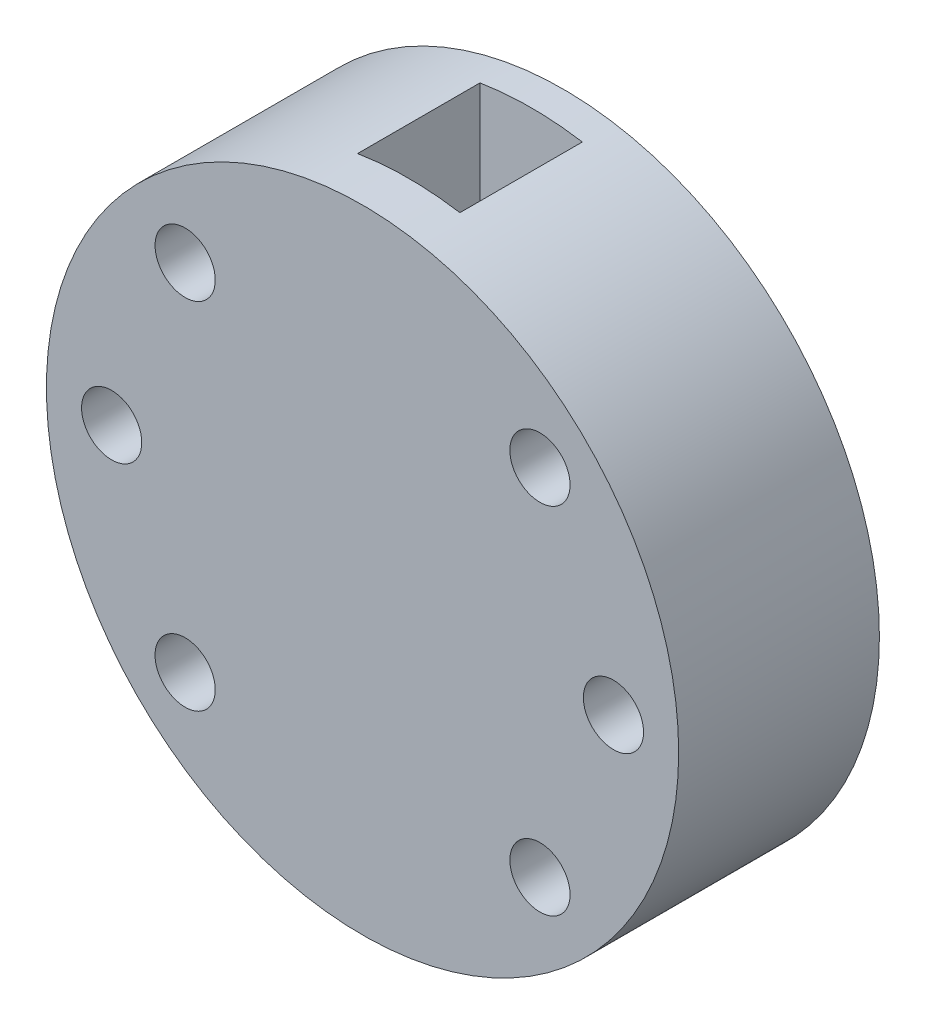
ISO-10303-21;
HEADER;
FILE_DESCRIPTION(('STEP AP214'),'2;1');
FILE_NAME('part.step','',(''),(''),'','','');
FILE_SCHEMA(('AUTOMOTIVE_DESIGN { 1 0 10303 214 1 1 1 1 }'));
ENDSEC;
DATA;
#1=APPLICATION_CONTEXT('core data for automotive mechanical design processes');
#2=APPLICATION_PROTOCOL_DEFINITION('international standard','automotive_design',2000,#1);
#3=PRODUCT_CONTEXT('',#1,'mechanical');
#4=PRODUCT('Part','Part','',(#3));
#5=PRODUCT_RELATED_PRODUCT_CATEGORY('part','',(#4));
#6=PRODUCT_DEFINITION_FORMATION('','',#4);
#7=PRODUCT_DEFINITION_CONTEXT('part definition',#1,'design');
#8=PRODUCT_DEFINITION('design','',#6,#7);
#9=PRODUCT_DEFINITION_SHAPE('','',#8);
#10=(LENGTH_UNIT() NAMED_UNIT(*) SI_UNIT(.MILLI.,.METRE.));
#11=(NAMED_UNIT(*) PLANE_ANGLE_UNIT() SI_UNIT($,.RADIAN.));
#12=(NAMED_UNIT(*) SI_UNIT($,.STERADIAN.) SOLID_ANGLE_UNIT());
#13=UNCERTAINTY_MEASURE_WITH_UNIT(LENGTH_MEASURE(1.E-05),#10,'distance_accuracy_value','');
#14=(GEOMETRIC_REPRESENTATION_CONTEXT(3) GLOBAL_UNCERTAINTY_ASSIGNED_CONTEXT((#13)) GLOBAL_UNIT_ASSIGNED_CONTEXT((#10,
#11,#12)) REPRESENTATION_CONTEXT('',''));
#15=CARTESIAN_POINT('',(0.,0.,0.));
#16=DIRECTION('',(0.,0.,1.));
#17=DIRECTION('',(1.,0.,0.));
#18=AXIS2_PLACEMENT_3D('',#15,#16,#17);
#19=CARTESIAN_POINT('',(0.,0.,20.));
#20=DIRECTION('',(0.,0.,-1.));
#21=DIRECTION('',(-1.,0.,0.));
#22=AXIS2_PLACEMENT_3D('',#19,#20,#21);
#23=CYLINDRICAL_SURFACE('',#22,31.5);
#24=DIRECTION('',(0.,0.,-1.));
#25=VECTOR('',#24,1.);
#26=CARTESIAN_POINT('',(5.1,-31.0844012327727,20.));
#27=LINE('',#26,#25);
#28=CARTESIAN_POINT('',(5.1,-31.0844012327727,3.2));
#29=VERTEX_POINT('',#28);
#30=CARTESIAN_POINT('',(5.1,-31.0844012327727,15.4));
#31=VERTEX_POINT('',#30);
#32=EDGE_CURVE('E108',#29,#31,#27,.F.);
#33=ORIENTED_EDGE('',*,*,#32,.F.);
#34=CARTESIAN_POINT('',(0.,0.,3.2));
#35=DIRECTION('',(0.,0.,1.));
#36=DIRECTION('',(1.,0.,0.));
#37=AXIS2_PLACEMENT_3D('',#34,#35,#36);
#38=CIRCLE('',#37,31.5);
#39=CARTESIAN_POINT('',(-5.1,-31.0844012327727,3.2));
#40=VERTEX_POINT('',#39);
#41=EDGE_CURVE('E104',#40,#29,#38,.T.);
#42=ORIENTED_EDGE('',*,*,#41,.F.);
#43=DIRECTION('',(0.,0.,-1.));
#44=VECTOR('',#43,1.);
#45=CARTESIAN_POINT('',(-5.1,-31.0844012327727,20.));
#46=LINE('',#45,#44);
#47=CARTESIAN_POINT('',(-5.1,-31.0844012327727,15.4));
#48=VERTEX_POINT('',#47);
#49=EDGE_CURVE('E88',#48,#40,#46,.T.);
#50=ORIENTED_EDGE('',*,*,#49,.F.);
#51=CARTESIAN_POINT('',(0.,0.,15.4));
#52=DIRECTION('',(0.,0.,-1.));
#53=DIRECTION('',(-1.,0.,0.));
#54=AXIS2_PLACEMENT_3D('',#51,#52,#53);
#55=CIRCLE('',#54,31.5);
#56=EDGE_CURVE('E82',#31,#48,#55,.T.);
#57=ORIENTED_EDGE('',*,*,#56,.F.);
#58=EDGE_LOOP('',(#33,#42,#50,#57));
#59=FACE_BOUND('',#58,.T.);
#60=CARTESIAN_POINT('',(0.,0.,20.));
#61=DIRECTION('',(0.,0.,1.));
#62=DIRECTION('',(1.,0.,0.));
#63=AXIS2_PLACEMENT_3D('',#60,#61,#62);
#64=CIRCLE('',#63,31.5);
#65=CARTESIAN_POINT('',(31.5,0.,20.));
#66=VERTEX_POINT('',#65);
#67=EDGE_CURVE('E89',#66,#66,#64,.T.);
#68=ORIENTED_EDGE('',*,*,#67,.F.);
#69=EDGE_LOOP('',(#68));
#70=FACE_BOUND('',#69,.T.);
#71=CARTESIAN_POINT('',(0.,0.,0.));
#72=DIRECTION('',(0.,0.,1.));
#73=DIRECTION('',(1.,0.,0.));
#74=AXIS2_PLACEMENT_3D('',#71,#72,#73);
#75=CIRCLE('',#74,31.5);
#76=CARTESIAN_POINT('',(31.5,0.,0.));
#77=VERTEX_POINT('',#76);
#78=EDGE_CURVE('E201',#77,#77,#75,.T.);
#79=ORIENTED_EDGE('',*,*,#78,.T.);
#80=EDGE_LOOP('',(#79));
#81=FACE_BOUND('',#80,.T.);
#82=DIRECTION('',(0.,0.,-1.));
#83=VECTOR('',#82,1.);
#84=CARTESIAN_POINT('',(5.1,31.0844012327727,20.));
#85=LINE('',#84,#83);
#86=CARTESIAN_POINT('',(5.1,31.0844012327727,15.4));
#87=VERTEX_POINT('',#86);
#88=CARTESIAN_POINT('',(5.1,31.0844012327727,3.2));
#89=VERTEX_POINT('',#88);
#90=EDGE_CURVE('E11',#87,#89,#85,.T.);
#91=ORIENTED_EDGE('',*,*,#90,.F.);
#92=CARTESIAN_POINT('',(-5.1,31.0844012327727,15.4));
#93=VERTEX_POINT('',#92);
#94=EDGE_CURVE('E91',#93,#87,#55,.T.);
#95=ORIENTED_EDGE('',*,*,#94,.F.);
#96=DIRECTION('',(0.,0.,-1.));
#97=VECTOR('',#96,1.);
#98=CARTESIAN_POINT('',(-5.1,31.0844012327727,20.));
#99=LINE('',#98,#97);
#100=CARTESIAN_POINT('',(-5.1,31.0844012327727,3.2));
#101=VERTEX_POINT('',#100);
#102=EDGE_CURVE('E97',#101,#93,#99,.F.);
#103=ORIENTED_EDGE('',*,*,#102,.F.);
#104=EDGE_CURVE('E52',#89,#101,#38,.T.);
#105=ORIENTED_EDGE('',*,*,#104,.F.);
#106=EDGE_LOOP('',(#91,#95,#103,#105));
#107=FACE_BOUND('',#106,.T.);
#108=ADVANCED_FACE('F43',(#59,#70,#81,#107),#23,.T.);
#109=CARTESIAN_POINT('',(0.,0.,20.));
#110=DIRECTION('',(0.,0.,1.));
#111=DIRECTION('',(1.,0.,0.));
#112=AXIS2_PLACEMENT_3D('',#109,#110,#111);
#113=PLANE('',#112);
#114=CARTESIAN_POINT('',(17.6776695296637,17.6776695296637,20.));
#115=DIRECTION('',(0.,0.,1.));
#116=DIRECTION('',(1.,0.,0.));
#117=AXIS2_PLACEMENT_3D('',#114,#115,#116);
#118=CIRCLE('',#117,3.);
#119=CARTESIAN_POINT('',(20.6776695296637,17.6776695296637,20.));
#120=VERTEX_POINT('',#119);
#121=EDGE_CURVE('E596',#120,#120,#118,.T.);
#122=ORIENTED_EDGE('',*,*,#121,.F.);
#123=EDGE_LOOP('',(#122));
#124=FACE_BOUND('',#123,.T.);
#125=CARTESIAN_POINT('',(25.,0.,20.));
#126=DIRECTION('',(0.,0.,1.));
#127=DIRECTION('',(1.,0.,0.));
#128=AXIS2_PLACEMENT_3D('',#125,#126,#127);
#129=CIRCLE('',#128,3.);
#130=CARTESIAN_POINT('',(28.,0.,20.));
#131=VERTEX_POINT('',#130);
#132=EDGE_CURVE('E592',#131,#131,#129,.T.);
#133=ORIENTED_EDGE('',*,*,#132,.F.);
#134=EDGE_LOOP('',(#133));
#135=FACE_BOUND('',#134,.T.);
#136=CARTESIAN_POINT('',(17.6776695296637,-17.6776695296637,20.));
#137=DIRECTION('',(0.,0.,1.));
#138=DIRECTION('',(1.,0.,0.));
#139=AXIS2_PLACEMENT_3D('',#136,#137,#138);
#140=CIRCLE('',#139,3.);
#141=CARTESIAN_POINT('',(20.6776695296637,-17.6776695296637,20.));
#142=VERTEX_POINT('',#141);
#143=EDGE_CURVE('E586',#142,#142,#140,.T.);
#144=ORIENTED_EDGE('',*,*,#143,.F.);
#145=EDGE_LOOP('',(#144));
#146=FACE_BOUND('',#145,.T.);
#147=CARTESIAN_POINT('',(-17.6776695296637,-17.6776695296637,20.));
#148=DIRECTION('',(0.,0.,1.));
#149=DIRECTION('',(1.,0.,0.));
#150=AXIS2_PLACEMENT_3D('',#147,#148,#149);
#151=CIRCLE('',#150,3.);
#152=CARTESIAN_POINT('',(-14.6776695296637,-17.6776695296637,20.));
#153=VERTEX_POINT('',#152);
#154=EDGE_CURVE('E580',#153,#153,#151,.T.);
#155=ORIENTED_EDGE('',*,*,#154,.F.);
#156=EDGE_LOOP('',(#155));
#157=FACE_BOUND('',#156,.T.);
#158=CARTESIAN_POINT('',(-25.,0.,20.));
#159=DIRECTION('',(0.,0.,1.));
#160=DIRECTION('',(1.,0.,0.));
#161=AXIS2_PLACEMENT_3D('',#158,#159,#160);
#162=CIRCLE('',#161,3.);
#163=CARTESIAN_POINT('',(-22.,0.,20.));
#164=VERTEX_POINT('',#163);
#165=EDGE_CURVE('E577',#164,#164,#162,.T.);
#166=ORIENTED_EDGE('',*,*,#165,.F.);
#167=EDGE_LOOP('',(#166));
#168=FACE_BOUND('',#167,.T.);
#169=CARTESIAN_POINT('',(-17.6776695296637,17.6776695296637,20.));
#170=DIRECTION('',(0.,0.,1.));
#171=DIRECTION('',(1.,0.,0.));
#172=AXIS2_PLACEMENT_3D('',#169,#170,#171);
#173=CIRCLE('',#172,3.);
#174=CARTESIAN_POINT('',(-14.6776695296637,17.6776695296637,20.));
#175=VERTEX_POINT('',#174);
#176=EDGE_CURVE('E121',#175,#175,#173,.T.);
#177=ORIENTED_EDGE('',*,*,#176,.F.);
#178=EDGE_LOOP('',(#177));
#179=FACE_BOUND('',#178,.T.);
#180=ORIENTED_EDGE('',*,*,#67,.T.);
#181=EDGE_LOOP('',(#180));
#182=FACE_BOUND('',#181,.T.);
#183=ADVANCED_FACE('F213',(#124,#135,#146,#157,#168,#179,#182),#113,.T.);
#184=CARTESIAN_POINT('',(0.,0.,0.));
#185=DIRECTION('',(0.,0.,1.));
#186=DIRECTION('',(1.,0.,0.));
#187=AXIS2_PLACEMENT_3D('',#184,#185,#186);
#188=PLANE('',#187);
#189=CARTESIAN_POINT('',(-17.6776695296637,-17.6776695296637,0.));
#190=DIRECTION('',(0.,0.,1.));
#191=DIRECTION('',(1.,0.,0.));
#192=AXIS2_PLACEMENT_3D('',#189,#190,#191);
#193=CIRCLE('',#192,4.5);
#194=CARTESIAN_POINT('',(-13.1776695296637,-17.6776695296637,0.));
#195=VERTEX_POINT('',#194);
#196=EDGE_CURVE('E154',#195,#195,#193,.T.);
#197=ORIENTED_EDGE('',*,*,#196,.T.);
#198=EDGE_LOOP('',(#197));
#199=FACE_BOUND('',#198,.T.);
#200=CARTESIAN_POINT('',(-17.6776695296637,17.6776695296637,0.));
#201=DIRECTION('',(0.,0.,1.));
#202=DIRECTION('',(1.,0.,0.));
#203=AXIS2_PLACEMENT_3D('',#200,#201,#202);
#204=CIRCLE('',#203,4.5);
#205=CARTESIAN_POINT('',(-13.1776695296637,17.6776695296637,0.));
#206=VERTEX_POINT('',#205);
#207=EDGE_CURVE('E163',#206,#206,#204,.T.);
#208=ORIENTED_EDGE('',*,*,#207,.T.);
#209=EDGE_LOOP('',(#208));
#210=FACE_BOUND('',#209,.T.);
#211=CARTESIAN_POINT('',(17.6776695296637,-17.6776695296637,0.));
#212=DIRECTION('',(0.,0.,1.));
#213=DIRECTION('',(1.,0.,0.));
#214=AXIS2_PLACEMENT_3D('',#211,#212,#213);
#215=CIRCLE('',#214,4.5);
#216=CARTESIAN_POINT('',(22.1776695296637,-17.6776695296637,0.));
#217=VERTEX_POINT('',#216);
#218=EDGE_CURVE('E171',#217,#217,#215,.T.);
#219=ORIENTED_EDGE('',*,*,#218,.T.);
#220=EDGE_LOOP('',(#219));
#221=FACE_BOUND('',#220,.T.);
#222=CARTESIAN_POINT('',(25.,0.,0.));
#223=DIRECTION('',(0.,0.,1.));
#224=DIRECTION('',(1.,0.,0.));
#225=AXIS2_PLACEMENT_3D('',#222,#223,#224);
#226=CIRCLE('',#225,4.5);
#227=CARTESIAN_POINT('',(29.5,0.,0.));
#228=VERTEX_POINT('',#227);
#229=EDGE_CURVE('E179',#228,#228,#226,.T.);
#230=ORIENTED_EDGE('',*,*,#229,.T.);
#231=EDGE_LOOP('',(#230));
#232=FACE_BOUND('',#231,.T.);
#233=CARTESIAN_POINT('',(17.6776695296637,17.6776695296637,0.));
#234=DIRECTION('',(0.,0.,1.));
#235=DIRECTION('',(1.,0.,0.));
#236=AXIS2_PLACEMENT_3D('',#233,#234,#235);
#237=CIRCLE('',#236,4.5);
#238=CARTESIAN_POINT('',(22.1776695296637,17.6776695296637,0.));
#239=VERTEX_POINT('',#238);
#240=EDGE_CURVE('E144',#239,#239,#237,.T.);
#241=ORIENTED_EDGE('',*,*,#240,.T.);
#242=EDGE_LOOP('',(#241));
#243=FACE_BOUND('',#242,.T.);
#244=CARTESIAN_POINT('',(-25.,0.,0.));
#245=DIRECTION('',(0.,0.,1.));
#246=DIRECTION('',(1.,0.,0.));
#247=AXIS2_PLACEMENT_3D('',#244,#245,#246);
#248=CIRCLE('',#247,4.5);
#249=CARTESIAN_POINT('',(-20.5,0.,0.));
#250=VERTEX_POINT('',#249);
#251=EDGE_CURVE('E158',#250,#250,#248,.T.);
#252=ORIENTED_EDGE('',*,*,#251,.T.);
#253=EDGE_LOOP('',(#252));
#254=FACE_BOUND('',#253,.T.);
#255=ORIENTED_EDGE('',*,*,#78,.F.);
#256=EDGE_LOOP('',(#255));
#257=FACE_BOUND('',#256,.T.);
#258=ADVANCED_FACE('F210',(#199,#210,#221,#232,#243,#254,#257),#188,.F.);
#259=CARTESIAN_POINT('',(5.1,58.2538296625874,3.2));
#260=DIRECTION('',(-1.,0.,0.));
#261=DIRECTION('',(0.,0.,1.));
#262=AXIS2_PLACEMENT_3D('',#259,#260,#261);
#263=PLANE('',#262);
#264=ORIENTED_EDGE('',*,*,#90,.T.);
#265=DIRECTION('',(0.,-1.,0.));
#266=VECTOR('',#265,1.);
#267=CARTESIAN_POINT('',(5.1,58.2538296625874,3.2));
#268=LINE('',#267,#266);
#269=EDGE_CURVE('E197',#89,#29,#268,.T.);
#270=ORIENTED_EDGE('',*,*,#269,.T.);
#271=ORIENTED_EDGE('',*,*,#32,.T.);
#272=DIRECTION('',(0.,-1.,0.));
#273=VECTOR('',#272,1.);
#274=CARTESIAN_POINT('',(5.1,58.2538296625874,15.4));
#275=LINE('',#274,#273);
#276=EDGE_CURVE('E65',#87,#31,#275,.T.);
#277=ORIENTED_EDGE('',*,*,#276,.F.);
#278=EDGE_LOOP('',(#264,#270,#271,#277));
#279=FACE_BOUND('',#278,.T.);
#280=ADVANCED_FACE('F212',(#279),#263,.T.);
#281=CARTESIAN_POINT('',(-5.1,58.2538296625874,3.2));
#282=DIRECTION('',(0.,0.,1.));
#283=DIRECTION('',(1.,0.,0.));
#284=AXIS2_PLACEMENT_3D('',#281,#282,#283);
#285=PLANE('',#284);
#286=ORIENTED_EDGE('',*,*,#104,.T.);
#287=DIRECTION('',(0.,-1.,0.));
#288=VECTOR('',#287,1.);
#289=CARTESIAN_POINT('',(-5.1,58.2538296625874,3.2));
#290=LINE('',#289,#288);
#291=EDGE_CURVE('E100',#101,#40,#290,.T.);
#292=ORIENTED_EDGE('',*,*,#291,.T.);
#293=ORIENTED_EDGE('',*,*,#41,.T.);
#294=ORIENTED_EDGE('',*,*,#269,.F.);
#295=EDGE_LOOP('',(#286,#292,#293,#294));
#296=FACE_BOUND('',#295,.T.);
#297=ADVANCED_FACE('F219',(#296),#285,.T.);
#298=CARTESIAN_POINT('',(-5.1,58.2538296625874,15.4));
#299=DIRECTION('',(1.,0.,0.));
#300=DIRECTION('',(0.,0.,-1.));
#301=AXIS2_PLACEMENT_3D('',#298,#299,#300);
#302=PLANE('',#301);
#303=ORIENTED_EDGE('',*,*,#49,.T.);
#304=ORIENTED_EDGE('',*,*,#291,.F.);
#305=ORIENTED_EDGE('',*,*,#102,.T.);
#306=DIRECTION('',(0.,-1.,0.));
#307=VECTOR('',#306,1.);
#308=CARTESIAN_POINT('',(-5.1,58.2538296625874,15.4));
#309=LINE('',#308,#307);
#310=EDGE_CURVE('E60',#93,#48,#309,.T.);
#311=ORIENTED_EDGE('',*,*,#310,.T.);
#312=EDGE_LOOP('',(#303,#304,#305,#311));
#313=FACE_BOUND('',#312,.T.);
#314=ADVANCED_FACE('F93',(#313),#302,.T.);
#315=CARTESIAN_POINT('',(5.1,58.2538296625874,15.4));
#316=DIRECTION('',(0.,0.,-1.));
#317=DIRECTION('',(-1.,0.,0.));
#318=AXIS2_PLACEMENT_3D('',#315,#316,#317);
#319=PLANE('',#318);
#320=ORIENTED_EDGE('',*,*,#94,.T.);
#321=ORIENTED_EDGE('',*,*,#276,.T.);
#322=ORIENTED_EDGE('',*,*,#56,.T.);
#323=ORIENTED_EDGE('',*,*,#310,.F.);
#324=EDGE_LOOP('',(#320,#321,#322,#323));
#325=FACE_BOUND('',#324,.T.);
#326=ADVANCED_FACE('F83',(#325),#319,.T.);
#327=CARTESIAN_POINT('',(-25.,0.,6.));
#328=DIRECTION('',(0.,0.,-1.));
#329=DIRECTION('',(-1.,0.,0.));
#330=AXIS2_PLACEMENT_3D('',#327,#328,#329);
#331=CYLINDRICAL_SURFACE('',#330,4.5);
#332=CARTESIAN_POINT('',(-25.,0.,6.));
#333=DIRECTION('',(0.,0.,1.));
#334=DIRECTION('',(1.,0.,0.));
#335=AXIS2_PLACEMENT_3D('',#332,#333,#334);
#336=CIRCLE('',#335,4.5);
#337=CARTESIAN_POINT('',(-20.5,0.,6.));
#338=VERTEX_POINT('',#337);
#339=EDGE_CURVE('E186',#338,#338,#336,.T.);
#340=ORIENTED_EDGE('',*,*,#339,.T.);
#341=EDGE_LOOP('',(#340));
#342=FACE_BOUND('',#341,.T.);
#343=ORIENTED_EDGE('',*,*,#251,.F.);
#344=EDGE_LOOP('',(#343));
#345=FACE_BOUND('',#344,.T.);
#346=ADVANCED_FACE('F252',(#342,#345),#331,.F.);
#347=CARTESIAN_POINT('',(-25.,0.,6.));
#348=DIRECTION('',(0.,0.,1.));
#349=DIRECTION('',(1.,0.,0.));
#350=AXIS2_PLACEMENT_3D('',#347,#348,#349);
#351=PLANE('',#350);
#352=CARTESIAN_POINT('',(-25.,0.,6.));
#353=DIRECTION('',(0.,0.,1.));
#354=DIRECTION('',(1.,0.,0.));
#355=AXIS2_PLACEMENT_3D('',#352,#353,#354);
#356=CIRCLE('',#355,3.);
#357=CARTESIAN_POINT('',(-22.,0.,6.));
#358=VERTEX_POINT('',#357);
#359=EDGE_CURVE('E46',#358,#358,#356,.F.);
#360=ORIENTED_EDGE('',*,*,#359,.F.);
#361=EDGE_LOOP('',(#360));
#362=FACE_BOUND('',#361,.T.);
#363=ORIENTED_EDGE('',*,*,#339,.F.);
#364=EDGE_LOOP('',(#363));
#365=FACE_BOUND('',#364,.T.);
#366=ADVANCED_FACE('F246',(#362,#365),#351,.F.);
#367=CARTESIAN_POINT('',(17.6776695296637,17.6776695296637,6.));
#368=DIRECTION('',(0.,0.,-1.));
#369=DIRECTION('',(-1.,0.,0.));
#370=AXIS2_PLACEMENT_3D('',#367,#368,#369);
#371=CYLINDRICAL_SURFACE('',#370,4.5);
#372=CARTESIAN_POINT('',(17.6776695296637,17.6776695296637,6.));
#373=DIRECTION('',(0.,0.,1.));
#374=DIRECTION('',(1.,0.,0.));
#375=AXIS2_PLACEMENT_3D('',#372,#373,#374);
#376=CIRCLE('',#375,4.5);
#377=CARTESIAN_POINT('',(22.1776695296637,17.6776695296637,6.));
#378=VERTEX_POINT('',#377);
#379=EDGE_CURVE('E139',#378,#378,#376,.T.);
#380=ORIENTED_EDGE('',*,*,#379,.T.);
#381=EDGE_LOOP('',(#380));
#382=FACE_BOUND('',#381,.T.);
#383=ORIENTED_EDGE('',*,*,#240,.F.);
#384=EDGE_LOOP('',(#383));
#385=FACE_BOUND('',#384,.T.);
#386=ADVANCED_FACE('F251',(#382,#385),#371,.F.);
#387=CARTESIAN_POINT('',(17.6776695296637,17.6776695296637,6.));
#388=DIRECTION('',(0.,0.,1.));
#389=DIRECTION('',(1.,0.,0.));
#390=AXIS2_PLACEMENT_3D('',#387,#388,#389);
#391=PLANE('',#390);
#392=CARTESIAN_POINT('',(17.6776695296637,17.6776695296637,6.));
#393=DIRECTION('',(0.,0.,1.));
#394=DIRECTION('',(1.,0.,0.));
#395=AXIS2_PLACEMENT_3D('',#392,#393,#394);
#396=CIRCLE('',#395,3.);
#397=CARTESIAN_POINT('',(20.6776695296637,17.6776695296637,6.));
#398=VERTEX_POINT('',#397);
#399=EDGE_CURVE('E132',#398,#398,#396,.F.);
#400=ORIENTED_EDGE('',*,*,#399,.F.);
#401=EDGE_LOOP('',(#400));
#402=FACE_BOUND('',#401,.T.);
#403=ORIENTED_EDGE('',*,*,#379,.F.);
#404=EDGE_LOOP('',(#403));
#405=FACE_BOUND('',#404,.T.);
#406=ADVANCED_FACE('F263',(#402,#405),#391,.F.);
#407=CARTESIAN_POINT('',(25.,0.,6.));
#408=DIRECTION('',(0.,0.,-1.));
#409=DIRECTION('',(-1.,0.,0.));
#410=AXIS2_PLACEMENT_3D('',#407,#408,#409);
#411=CYLINDRICAL_SURFACE('',#410,4.5);
#412=CARTESIAN_POINT('',(25.,0.,6.));
#413=DIRECTION('',(0.,0.,1.));
#414=DIRECTION('',(1.,0.,0.));
#415=AXIS2_PLACEMENT_3D('',#412,#413,#414);
#416=CIRCLE('',#415,4.5);
#417=CARTESIAN_POINT('',(29.5,0.,6.));
#418=VERTEX_POINT('',#417);
#419=EDGE_CURVE('E150',#418,#418,#416,.T.);
#420=ORIENTED_EDGE('',*,*,#419,.T.);
#421=EDGE_LOOP('',(#420));
#422=FACE_BOUND('',#421,.T.);
#423=ORIENTED_EDGE('',*,*,#229,.F.);
#424=EDGE_LOOP('',(#423));
#425=FACE_BOUND('',#424,.T.);
#426=ADVANCED_FACE('F268',(#422,#425),#411,.F.);
#427=CARTESIAN_POINT('',(25.,0.,6.));
#428=DIRECTION('',(0.,0.,1.));
#429=DIRECTION('',(1.,0.,0.));
#430=AXIS2_PLACEMENT_3D('',#427,#428,#429);
#431=PLANE('',#430);
#432=CARTESIAN_POINT('',(25.,0.,6.));
#433=DIRECTION('',(0.,0.,1.));
#434=DIRECTION('',(1.,0.,0.));
#435=AXIS2_PLACEMENT_3D('',#432,#433,#434);
#436=CIRCLE('',#435,3.);
#437=CARTESIAN_POINT('',(28.,0.,6.));
#438=VERTEX_POINT('',#437);
#439=EDGE_CURVE('E129',#438,#438,#436,.F.);
#440=ORIENTED_EDGE('',*,*,#439,.F.);
#441=EDGE_LOOP('',(#440));
#442=FACE_BOUND('',#441,.T.);
#443=ORIENTED_EDGE('',*,*,#419,.F.);
#444=EDGE_LOOP('',(#443));
#445=FACE_BOUND('',#444,.T.);
#446=ADVANCED_FACE('F277',(#442,#445),#431,.F.);
#447=CARTESIAN_POINT('',(17.6776695296637,-17.6776695296637,6.));
#448=DIRECTION('',(0.,0.,-1.));
#449=DIRECTION('',(-1.,0.,0.));
#450=AXIS2_PLACEMENT_3D('',#447,#448,#449);
#451=CYLINDRICAL_SURFACE('',#450,4.5);
#452=CARTESIAN_POINT('',(17.6776695296637,-17.6776695296637,6.));
#453=DIRECTION('',(0.,0.,1.));
#454=DIRECTION('',(1.,0.,0.));
#455=AXIS2_PLACEMENT_3D('',#452,#453,#454);
#456=CIRCLE('',#455,4.5);
#457=CARTESIAN_POINT('',(22.1776695296637,-17.6776695296637,6.));
#458=VERTEX_POINT('',#457);
#459=EDGE_CURVE('E175',#458,#458,#456,.T.);
#460=ORIENTED_EDGE('',*,*,#459,.T.);
#461=EDGE_LOOP('',(#460));
#462=FACE_BOUND('',#461,.T.);
#463=ORIENTED_EDGE('',*,*,#218,.F.);
#464=EDGE_LOOP('',(#463));
#465=FACE_BOUND('',#464,.T.);
#466=ADVANCED_FACE('F282',(#462,#465),#451,.F.);
#467=CARTESIAN_POINT('',(17.6776695296637,-17.6776695296637,6.));
#468=DIRECTION('',(0.,0.,1.));
#469=DIRECTION('',(1.,0.,0.));
#470=AXIS2_PLACEMENT_3D('',#467,#468,#469);
#471=PLANE('',#470);
#472=CARTESIAN_POINT('',(17.6776695296637,-17.6776695296637,6.));
#473=DIRECTION('',(0.,0.,1.));
#474=DIRECTION('',(1.,0.,0.));
#475=AXIS2_PLACEMENT_3D('',#472,#473,#474);
#476=CIRCLE('',#475,3.);
#477=CARTESIAN_POINT('',(20.6776695296637,-17.6776695296637,6.));
#478=VERTEX_POINT('',#477);
#479=EDGE_CURVE('E125',#478,#478,#476,.F.);
#480=ORIENTED_EDGE('',*,*,#479,.F.);
#481=EDGE_LOOP('',(#480));
#482=FACE_BOUND('',#481,.T.);
#483=ORIENTED_EDGE('',*,*,#459,.F.);
#484=EDGE_LOOP('',(#483));
#485=FACE_BOUND('',#484,.T.);
#486=ADVANCED_FACE('F291',(#482,#485),#471,.F.);
#487=CARTESIAN_POINT('',(-17.6776695296637,17.6776695296637,6.));
#488=DIRECTION('',(0.,0.,-1.));
#489=DIRECTION('',(-1.,0.,0.));
#490=AXIS2_PLACEMENT_3D('',#487,#488,#489);
#491=CYLINDRICAL_SURFACE('',#490,4.5);
#492=CARTESIAN_POINT('',(-17.6776695296637,17.6776695296637,6.));
#493=DIRECTION('',(0.,0.,1.));
#494=DIRECTION('',(1.,0.,0.));
#495=AXIS2_PLACEMENT_3D('',#492,#493,#494);
#496=CIRCLE('',#495,4.5);
#497=CARTESIAN_POINT('',(-13.1776695296637,17.6776695296637,6.));
#498=VERTEX_POINT('',#497);
#499=EDGE_CURVE('E167',#498,#498,#496,.T.);
#500=ORIENTED_EDGE('',*,*,#499,.T.);
#501=EDGE_LOOP('',(#500));
#502=FACE_BOUND('',#501,.T.);
#503=ORIENTED_EDGE('',*,*,#207,.F.);
#504=EDGE_LOOP('',(#503));
#505=FACE_BOUND('',#504,.T.);
#506=ADVANCED_FACE('F296',(#502,#505),#491,.F.);
#507=CARTESIAN_POINT('',(-17.6776695296637,17.6776695296637,6.));
#508=DIRECTION('',(0.,0.,1.));
#509=DIRECTION('',(1.,0.,0.));
#510=AXIS2_PLACEMENT_3D('',#507,#508,#509);
#511=PLANE('',#510);
#512=CARTESIAN_POINT('',(-17.6776695296637,17.6776695296637,6.));
#513=DIRECTION('',(0.,0.,1.));
#514=DIRECTION('',(1.,0.,0.));
#515=AXIS2_PLACEMENT_3D('',#512,#513,#514);
#516=CIRCLE('',#515,3.);
#517=CARTESIAN_POINT('',(-14.6776695296637,17.6776695296637,6.));
#518=VERTEX_POINT('',#517);
#519=EDGE_CURVE('E120',#518,#518,#516,.F.);
#520=ORIENTED_EDGE('',*,*,#519,.F.);
#521=EDGE_LOOP('',(#520));
#522=FACE_BOUND('',#521,.T.);
#523=ORIENTED_EDGE('',*,*,#499,.F.);
#524=EDGE_LOOP('',(#523));
#525=FACE_BOUND('',#524,.T.);
#526=ADVANCED_FACE('F305',(#522,#525),#511,.F.);
#527=CARTESIAN_POINT('',(-17.6776695296637,-17.6776695296637,6.));
#528=DIRECTION('',(0.,0.,-1.));
#529=DIRECTION('',(-1.,0.,0.));
#530=AXIS2_PLACEMENT_3D('',#527,#528,#529);
#531=CYLINDRICAL_SURFACE('',#530,4.5);
#532=CARTESIAN_POINT('',(-17.6776695296637,-17.6776695296637,6.));
#533=DIRECTION('',(0.,0.,1.));
#534=DIRECTION('',(1.,0.,0.));
#535=AXIS2_PLACEMENT_3D('',#532,#533,#534);
#536=CIRCLE('',#535,4.5);
#537=CARTESIAN_POINT('',(-13.1776695296637,-17.6776695296637,6.));
#538=VERTEX_POINT('',#537);
#539=EDGE_CURVE('E159',#538,#538,#536,.T.);
#540=ORIENTED_EDGE('',*,*,#539,.T.);
#541=EDGE_LOOP('',(#540));
#542=FACE_BOUND('',#541,.T.);
#543=ORIENTED_EDGE('',*,*,#196,.F.);
#544=EDGE_LOOP('',(#543));
#545=FACE_BOUND('',#544,.T.);
#546=ADVANCED_FACE('F241',(#542,#545),#531,.F.);
#547=CARTESIAN_POINT('',(-17.6776695296637,-17.6776695296637,6.));
#548=DIRECTION('',(0.,0.,1.));
#549=DIRECTION('',(1.,0.,0.));
#550=AXIS2_PLACEMENT_3D('',#547,#548,#549);
#551=PLANE('',#550);
#552=CARTESIAN_POINT('',(-17.6776695296637,-17.6776695296637,6.));
#553=DIRECTION('',(0.,0.,1.));
#554=DIRECTION('',(1.,0.,0.));
#555=AXIS2_PLACEMENT_3D('',#552,#553,#554);
#556=CIRCLE('',#555,3.);
#557=CARTESIAN_POINT('',(-14.6776695296637,-17.6776695296637,6.));
#558=VERTEX_POINT('',#557);
#559=EDGE_CURVE('E116',#558,#558,#556,.F.);
#560=ORIENTED_EDGE('',*,*,#559,.F.);
#561=EDGE_LOOP('',(#560));
#562=FACE_BOUND('',#561,.T.);
#563=ORIENTED_EDGE('',*,*,#539,.F.);
#564=EDGE_LOOP('',(#563));
#565=FACE_BOUND('',#564,.T.);
#566=ADVANCED_FACE('F316',(#562,#565),#551,.F.);
#567=CARTESIAN_POINT('',(-17.6776695296637,-17.6776695296637,20.));
#568=DIRECTION('',(0.,0.,-1.));
#569=DIRECTION('',(-1.,0.,0.));
#570=AXIS2_PLACEMENT_3D('',#567,#568,#569);
#571=CYLINDRICAL_SURFACE('',#570,3.);
#572=ORIENTED_EDGE('',*,*,#154,.T.);
#573=EDGE_LOOP('',(#572));
#574=FACE_BOUND('',#573,.T.);
#575=ORIENTED_EDGE('',*,*,#559,.T.);
#576=EDGE_LOOP('',(#575));
#577=FACE_BOUND('',#576,.T.);
#578=ADVANCED_FACE('F321',(#574,#577),#571,.F.);
#579=CARTESIAN_POINT('',(-17.6776695296637,17.6776695296637,20.));
#580=DIRECTION('',(0.,0.,-1.));
#581=DIRECTION('',(-1.,0.,0.));
#582=AXIS2_PLACEMENT_3D('',#579,#580,#581);
#583=CYLINDRICAL_SURFACE('',#582,3.);
#584=ORIENTED_EDGE('',*,*,#176,.T.);
#585=EDGE_LOOP('',(#584));
#586=FACE_BOUND('',#585,.T.);
#587=ORIENTED_EDGE('',*,*,#519,.T.);
#588=EDGE_LOOP('',(#587));
#589=FACE_BOUND('',#588,.T.);
#590=ADVANCED_FACE('F332',(#586,#589),#583,.F.);
#591=CARTESIAN_POINT('',(17.6776695296637,-17.6776695296637,20.));
#592=DIRECTION('',(0.,0.,-1.));
#593=DIRECTION('',(-1.,0.,0.));
#594=AXIS2_PLACEMENT_3D('',#591,#592,#593);
#595=CYLINDRICAL_SURFACE('',#594,3.);
#596=ORIENTED_EDGE('',*,*,#143,.T.);
#597=EDGE_LOOP('',(#596));
#598=FACE_BOUND('',#597,.T.);
#599=ORIENTED_EDGE('',*,*,#479,.T.);
#600=EDGE_LOOP('',(#599));
#601=FACE_BOUND('',#600,.T.);
#602=ADVANCED_FACE('F343',(#598,#601),#595,.F.);
#603=CARTESIAN_POINT('',(25.,0.,20.));
#604=DIRECTION('',(0.,0.,-1.));
#605=DIRECTION('',(-1.,0.,0.));
#606=AXIS2_PLACEMENT_3D('',#603,#604,#605);
#607=CYLINDRICAL_SURFACE('',#606,3.);
#608=ORIENTED_EDGE('',*,*,#132,.T.);
#609=EDGE_LOOP('',(#608));
#610=FACE_BOUND('',#609,.T.);
#611=ORIENTED_EDGE('',*,*,#439,.T.);
#612=EDGE_LOOP('',(#611));
#613=FACE_BOUND('',#612,.T.);
#614=ADVANCED_FACE('F354',(#610,#613),#607,.F.);
#615=CARTESIAN_POINT('',(17.6776695296637,17.6776695296637,20.));
#616=DIRECTION('',(0.,0.,-1.));
#617=DIRECTION('',(-1.,0.,0.));
#618=AXIS2_PLACEMENT_3D('',#615,#616,#617);
#619=CYLINDRICAL_SURFACE('',#618,3.);
#620=ORIENTED_EDGE('',*,*,#121,.T.);
#621=EDGE_LOOP('',(#620));
#622=FACE_BOUND('',#621,.T.);
#623=ORIENTED_EDGE('',*,*,#399,.T.);
#624=EDGE_LOOP('',(#623));
#625=FACE_BOUND('',#624,.T.);
#626=ADVANCED_FACE('F365',(#622,#625),#619,.F.);
#627=CARTESIAN_POINT('',(-25.,0.,20.));
#628=DIRECTION('',(0.,0.,-1.));
#629=DIRECTION('',(-1.,0.,0.));
#630=AXIS2_PLACEMENT_3D('',#627,#628,#629);
#631=CYLINDRICAL_SURFACE('',#630,3.);
#632=ORIENTED_EDGE('',*,*,#165,.T.);
#633=EDGE_LOOP('',(#632));
#634=FACE_BOUND('',#633,.T.);
#635=ORIENTED_EDGE('',*,*,#359,.T.);
#636=EDGE_LOOP('',(#635));
#637=FACE_BOUND('',#636,.T.);
#638=ADVANCED_FACE('F376',(#634,#637),#631,.F.);
#639=CLOSED_SHELL('',(#108,#183,#258,#280,#297,#314,#326,#346,#366,#386,#406,#426,#446,#466,
#486,#506,#526,#546,#566,#578,#590,#602,#614,#626,#638));
#640=MANIFOLD_SOLID_BREP('B2',#639);
#641=ADVANCED_BREP_SHAPE_REPRESENTATION('',(#18,#640),#14);
#642=SHAPE_DEFINITION_REPRESENTATION(#9,#641);
ENDSEC;
END-ISO-10303-21;
